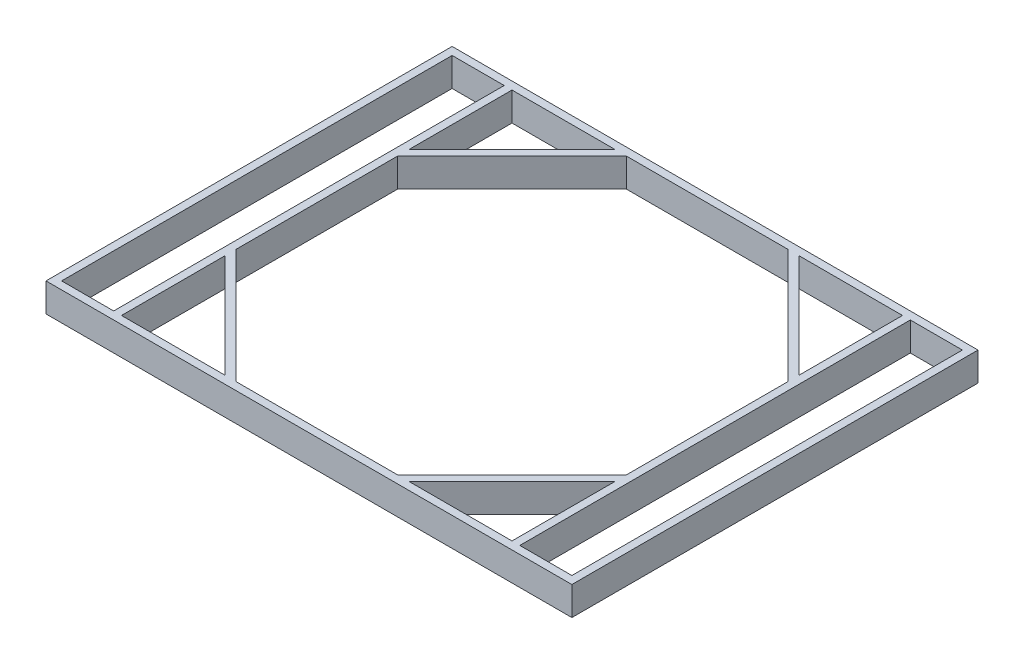
ISO-10303-21;
HEADER;
FILE_DESCRIPTION(('STEP AP214'),'2;1');
FILE_NAME('part.step','',(''),(''),'','','');
FILE_SCHEMA(('AUTOMOTIVE_DESIGN { 1 0 10303 214 1 1 1 1 }'));
ENDSEC;
DATA;
#1=APPLICATION_CONTEXT('core data for automotive mechanical design processes');
#2=APPLICATION_PROTOCOL_DEFINITION('international standard','automotive_design',2000,#1);
#3=PRODUCT_CONTEXT('',#1,'mechanical');
#4=PRODUCT('Part','Part','',(#3));
#5=PRODUCT_RELATED_PRODUCT_CATEGORY('part','',(#4));
#6=PRODUCT_DEFINITION_FORMATION('','',#4);
#7=PRODUCT_DEFINITION_CONTEXT('part definition',#1,'design');
#8=PRODUCT_DEFINITION('design','',#6,#7);
#9=PRODUCT_DEFINITION_SHAPE('','',#8);
#10=(LENGTH_UNIT() NAMED_UNIT(*) SI_UNIT(.MILLI.,.METRE.));
#11=(NAMED_UNIT(*) PLANE_ANGLE_UNIT() SI_UNIT($,.RADIAN.));
#12=(NAMED_UNIT(*) SI_UNIT($,.STERADIAN.) SOLID_ANGLE_UNIT());
#13=UNCERTAINTY_MEASURE_WITH_UNIT(LENGTH_MEASURE(1.E-05),#10,'distance_accuracy_value','');
#14=(GEOMETRIC_REPRESENTATION_CONTEXT(3) GLOBAL_UNCERTAINTY_ASSIGNED_CONTEXT((#13)) GLOBAL_UNIT_ASSIGNED_CONTEXT((#10,
#11,#12)) REPRESENTATION_CONTEXT('',''));
#15=CARTESIAN_POINT('',(0.,0.,0.));
#16=DIRECTION('',(0.,0.,1.));
#17=DIRECTION('',(1.,0.,0.));
#18=AXIS2_PLACEMENT_3D('',#15,#16,#17);
#19=CARTESIAN_POINT('',(0.,0.,0.));
#20=DIRECTION('',(0.,1.,0.));
#21=DIRECTION('',(0.,0.,1.));
#22=AXIS2_PLACEMENT_3D('',#19,#20,#21);
#23=PLANE('',#22);
#24=DIRECTION('',(0.,0.,1.));
#25=VECTOR('',#24,1.);
#26=CARTESIAN_POINT('',(30.6758446379566,0.,0.));
#27=LINE('',#26,#25);
#28=CARTESIAN_POINT('',(30.6758446379566,0.,15.6020555655613));
#29=VERTEX_POINT('',#28);
#30=CARTESIAN_POINT('',(30.6758446379568,0.,1920.60205556556));
#31=VERTEX_POINT('',#30);
#32=EDGE_CURVE('E716',#29,#31,#27,.T.);
#33=ORIENTED_EDGE('',*,*,#32,.F.);
#34=DIRECTION('',(1.,0.,0.));
#35=VECTOR('',#34,1.);
#36=CARTESIAN_POINT('',(0.,0.,15.6020555655613));
#37=LINE('',#36,#35);
#38=CARTESIAN_POINT('',(-223.324155362043,0.,15.6020555655613));
#39=VERTEX_POINT('',#38);
#40=EDGE_CURVE('E478',#39,#29,#37,.T.);
#41=ORIENTED_EDGE('',*,*,#40,.F.);
#42=DIRECTION('',(0.,0.,1.));
#43=VECTOR('',#42,1.);
#44=CARTESIAN_POINT('',(-223.324155362043,0.,0.));
#45=LINE('',#44,#43);
#46=CARTESIAN_POINT('',(-223.324155362043,0.,1920.60205556556));
#47=VERTEX_POINT('',#46);
#48=EDGE_CURVE('E695',#39,#47,#45,.T.);
#49=ORIENTED_EDGE('',*,*,#48,.T.);
#50=DIRECTION('',(1.,0.,0.));
#51=VECTOR('',#50,1.);
#52=CARTESIAN_POINT('',(0.,0.,1920.60205556556));
#53=LINE('',#52,#51);
#54=EDGE_CURVE('E512',#47,#31,#53,.T.);
#55=ORIENTED_EDGE('',*,*,#54,.T.);
#56=EDGE_LOOP('',(#33,#41,#49,#55));
#57=FACE_BOUND('',#56,.T.);
#58=DIRECTION('',(0.707106781186546,0.,-0.707106781186549));
#59=VECTOR('',#58,1.);
#60=CARTESIAN_POINT('',(294.228972658366,0.,294.228972658365));
#61=LINE('',#60,#59);
#62=CARTESIAN_POINT('',(68.7758446379566,0.,519.682100678775));
#63=VERTEX_POINT('',#62);
#64=CARTESIAN_POINT('',(572.855889751168,0.,15.6020555655612));
#65=VERTEX_POINT('',#64);
#66=EDGE_CURVE('E470',#63,#65,#61,.T.);
#67=ORIENTED_EDGE('',*,*,#66,.T.);
#68=CARTESIAN_POINT('',(68.7758446379566,0.,15.6020555655613));
#69=VERTEX_POINT('',#68);
#70=EDGE_CURVE('E466',#69,#65,#37,.T.);
#71=ORIENTED_EDGE('',*,*,#70,.F.);
#72=DIRECTION('',(0.,0.,1.));
#73=VECTOR('',#72,1.);
#74=CARTESIAN_POINT('',(68.7758446379566,0.,0.));
#75=LINE('',#74,#73);
#76=EDGE_CURVE('E471',#69,#63,#75,.T.);
#77=ORIENTED_EDGE('',*,*,#76,.T.);
#78=EDGE_LOOP('',(#67,#71,#77));
#79=FACE_BOUND('',#78,.T.);
#80=DIRECTION('',(0.707106781186546,0.,0.707106781186549));
#81=VECTOR('',#80,1.);
#82=CARTESIAN_POINT('',(700.106103616387,0.,-700.106103616385));
#83=LINE('',#82,#81);
#84=CARTESIAN_POINT('',(1415.81426279833,0.,15.6020555655613));
#85=VERTEX_POINT('',#84);
#86=CARTESIAN_POINT('',(1973.77584463796,0.,573.563637405189));
#87=VERTEX_POINT('',#86);
#88=EDGE_CURVE('E474',#85,#87,#83,.T.);
#89=ORIENTED_EDGE('',*,*,#88,.F.);
#90=CARTESIAN_POINT('',(626.737426477582,0.,15.6020555655613));
#91=VERTEX_POINT('',#90);
#92=EDGE_CURVE('E473',#91,#85,#37,.T.);
#93=ORIENTED_EDGE('',*,*,#92,.F.);
#94=DIRECTION('',(-0.707106781186546,0.,0.707106781186549));
#95=VECTOR('',#94,1.);
#96=CARTESIAN_POINT('',(321.169741021573,0.,321.169741021572));
#97=LINE('',#96,#95);
#98=CARTESIAN_POINT('',(68.7758446379566,0.,573.563637405189));
#99=VERTEX_POINT('',#98);
#100=EDGE_CURVE('E733',#91,#99,#97,.T.);
#101=ORIENTED_EDGE('',*,*,#100,.T.);
#102=CARTESIAN_POINT('',(68.7758446379567,0.,1362.64047372595));
#103=VERTEX_POINT('',#102);
#104=EDGE_CURVE('E692',#99,#103,#75,.T.);
#105=ORIENTED_EDGE('',*,*,#104,.T.);
#106=DIRECTION('',(-0.707106781186557,0.,-0.707106781186539));
#107=VECTOR('',#106,1.);
#108=CARTESIAN_POINT('',(-646.932314544,0.,646.932314544016));
#109=LINE('',#108,#107);
#110=CARTESIAN_POINT('',(626.737426477578,0.,1920.60205556556));
#111=VERTEX_POINT('',#110);
#112=EDGE_CURVE('E685',#111,#103,#109,.T.);
#113=ORIENTED_EDGE('',*,*,#112,.F.);
#114=CARTESIAN_POINT('',(1415.81426279833,0.,1920.60205556556));
#115=VERTEX_POINT('',#114);
#116=EDGE_CURVE('E683',#111,#115,#53,.T.);
#117=ORIENTED_EDGE('',*,*,#116,.T.);
#118=DIRECTION('',(-0.707106781186544,0.,0.707106781186551));
#119=VECTOR('',#118,1.);
#120=CARTESIAN_POINT('',(1668.20815918195,0.,1668.20815918194));
#121=LINE('',#120,#119);
#122=CARTESIAN_POINT('',(1973.77584463796,0.,1362.64047372593));
#123=VERTEX_POINT('',#122);
#124=EDGE_CURVE('E686',#123,#115,#121,.T.);
#125=ORIENTED_EDGE('',*,*,#124,.F.);
#126=DIRECTION('',(0.,0.,1.));
#127=VECTOR('',#126,1.);
#128=CARTESIAN_POINT('',(1973.77584463796,0.,-2.30061038127667E-13));
#129=LINE('',#128,#127);
#130=EDGE_CURVE('E457',#87,#123,#129,.T.);
#131=ORIENTED_EDGE('',*,*,#130,.F.);
#132=EDGE_LOOP('',(#89,#93,#101,#105,#113,#117,#125,#131));
#133=FACE_BOUND('',#132,.T.);
#134=CARTESIAN_POINT('',(1973.77584463796,0.,15.6020555655613));
#135=VERTEX_POINT('',#134);
#136=CARTESIAN_POINT('',(1973.77584463796,0.,519.682100678774));
#137=VERTEX_POINT('',#136);
#138=EDGE_CURVE('E456',#135,#137,#129,.T.);
#139=ORIENTED_EDGE('',*,*,#138,.F.);
#140=CARTESIAN_POINT('',(1469.69579952475,0.,15.6020555655613));
#141=VERTEX_POINT('',#140);
#142=EDGE_CURVE('E472',#141,#135,#37,.T.);
#143=ORIENTED_EDGE('',*,*,#142,.F.);
#144=DIRECTION('',(0.707106781186546,0.,0.707106781186549));
#145=VECTOR('',#144,1.);
#146=CARTESIAN_POINT('',(727.046871979594,0.,-727.046871979592));
#147=LINE('',#146,#145);
#148=EDGE_CURVE('E721',#141,#137,#147,.T.);
#149=ORIENTED_EDGE('',*,*,#148,.T.);
#150=EDGE_LOOP('',(#139,#143,#149));
#151=FACE_BOUND('',#150,.T.);
#152=DIRECTION('',(1.,0.,0.));
#153=VECTOR('',#152,1.);
#154=CARTESIAN_POINT('',(0.,0.,-22.4979444344387));
#155=LINE('',#154,#153);
#156=CARTESIAN_POINT('',(-261.424155362043,0.,-22.4979444344387));
#157=VERTEX_POINT('',#156);
#158=CARTESIAN_POINT('',(2303.97584463796,0.,-22.4979444344387));
#159=VERTEX_POINT('',#158);
#160=EDGE_CURVE('E697',#157,#159,#155,.T.);
#161=ORIENTED_EDGE('',*,*,#160,.T.);
#162=DIRECTION('',(0.,0.,1.));
#163=VECTOR('',#162,1.);
#164=CARTESIAN_POINT('',(2303.97584463796,0.,-5.1643994163078E-13));
#165=LINE('',#164,#163);
#166=CARTESIAN_POINT('',(2303.97584463796,0.,1958.70205556556));
#167=VERTEX_POINT('',#166);
#168=EDGE_CURVE('E737',#159,#167,#165,.T.);
#169=ORIENTED_EDGE('',*,*,#168,.T.);
#170=DIRECTION('',(1.,0.,0.));
#171=VECTOR('',#170,1.);
#172=CARTESIAN_POINT('',(0.,0.,1958.70205556556));
#173=LINE('',#172,#171);
#174=CARTESIAN_POINT('',(-261.424155362043,0.,1958.70205556556));
#175=VERTEX_POINT('',#174);
#176=EDGE_CURVE('E732',#175,#167,#173,.T.);
#177=ORIENTED_EDGE('',*,*,#176,.F.);
#178=DIRECTION('',(0.,0.,1.));
#179=VECTOR('',#178,1.);
#180=CARTESIAN_POINT('',(-261.424155362043,0.,0.));
#181=LINE('',#180,#179);
#182=EDGE_CURVE('E696',#157,#175,#181,.T.);
#183=ORIENTED_EDGE('',*,*,#182,.F.);
#184=EDGE_LOOP('',(#161,#169,#177,#183));
#185=FACE_BOUND('',#184,.T.);
#186=CARTESIAN_POINT('',(2011.87584463796,0.,15.6020555655613));
#187=VERTEX_POINT('',#186);
#188=CARTESIAN_POINT('',(2265.87584463796,0.,15.6020555655613));
#189=VERTEX_POINT('',#188);
#190=EDGE_CURVE('E465',#187,#189,#37,.T.);
#191=ORIENTED_EDGE('',*,*,#190,.F.);
#192=DIRECTION('',(0.,0.,1.));
#193=VECTOR('',#192,1.);
#194=CARTESIAN_POINT('',(2011.87584463796,0.,-4.69003860452335E-13));
#195=LINE('',#194,#193);
#196=CARTESIAN_POINT('',(2011.87584463796,0.,1920.60205556556));
#197=VERTEX_POINT('',#196);
#198=EDGE_CURVE('E462',#187,#197,#195,.T.);
#199=ORIENTED_EDGE('',*,*,#198,.T.);
#200=CARTESIAN_POINT('',(2265.87584463796,0.,1920.60205556556));
#201=VERTEX_POINT('',#200);
#202=EDGE_CURVE('E460',#197,#201,#53,.T.);
#203=ORIENTED_EDGE('',*,*,#202,.T.);
#204=DIRECTION('',(0.,0.,1.));
#205=VECTOR('',#204,1.);
#206=CARTESIAN_POINT('',(2265.87584463796,0.,0.));
#207=LINE('',#206,#205);
#208=EDGE_CURVE('E485',#189,#201,#207,.T.);
#209=ORIENTED_EDGE('',*,*,#208,.F.);
#210=EDGE_LOOP('',(#191,#199,#203,#209));
#211=FACE_BOUND('',#210,.T.);
#212=DIRECTION('',(0.707106781186544,0.,-0.707106781186551));
#213=VECTOR('',#212,1.);
#214=CARTESIAN_POINT('',(1695.14892754516,0.,1695.14892754514));
#215=LINE('',#214,#213);
#216=CARTESIAN_POINT('',(1469.69579952475,0.,1920.60205556556));
#217=VERTEX_POINT('',#216);
#218=CARTESIAN_POINT('',(1973.77584463796,0.,1416.52201045235));
#219=VERTEX_POINT('',#218);
#220=EDGE_CURVE('E449',#217,#219,#215,.T.);
#221=ORIENTED_EDGE('',*,*,#220,.F.);
#222=CARTESIAN_POINT('',(1973.77584463796,0.,1920.60205556556));
#223=VERTEX_POINT('',#222);
#224=EDGE_CURVE('E455',#217,#223,#53,.T.);
#225=ORIENTED_EDGE('',*,*,#224,.T.);
#226=EDGE_CURVE('E452',#219,#223,#129,.T.);
#227=ORIENTED_EDGE('',*,*,#226,.F.);
#228=EDGE_LOOP('',(#221,#225,#227));
#229=FACE_BOUND('',#228,.T.);
#230=DIRECTION('',(0.707106781186556,0.,0.707106781186539));
#231=VECTOR('',#230,1.);
#232=CARTESIAN_POINT('',(-673.873082907207,0.,673.873082907224));
#233=LINE('',#232,#231);
#234=CARTESIAN_POINT('',(68.7758446379567,0.,1416.52201045237));
#235=VERTEX_POINT('',#234);
#236=CARTESIAN_POINT('',(572.855889751162,0.,1920.60205556556));
#237=VERTEX_POINT('',#236);
#238=EDGE_CURVE('E380',#235,#237,#233,.T.);
#239=ORIENTED_EDGE('',*,*,#238,.F.);
#240=CARTESIAN_POINT('',(68.7758446379567,0.,1920.60205556556));
#241=VERTEX_POINT('',#240);
#242=EDGE_CURVE('E407',#235,#241,#75,.T.);
#243=ORIENTED_EDGE('',*,*,#242,.T.);
#244=EDGE_CURVE('E461',#241,#237,#53,.T.);
#245=ORIENTED_EDGE('',*,*,#244,.T.);
#246=EDGE_LOOP('',(#239,#243,#245));
#247=FACE_BOUND('',#246,.T.);
#248=ADVANCED_FACE('F154',(#57,#79,#133,#151,#185,#211,#229,#247),#23,.F.);
#249=CARTESIAN_POINT('',(0.,139.7,15.6020555655613));
#250=DIRECTION('',(0.,0.,-1.));
#251=DIRECTION('',(-1.,0.,0.));
#252=AXIS2_PLACEMENT_3D('',#249,#250,#251);
#253=PLANE('',#252);
#254=ORIENTED_EDGE('',*,*,#40,.T.);
#255=DIRECTION('',(0.,-1.,0.));
#256=VECTOR('',#255,1.);
#257=CARTESIAN_POINT('',(30.6758446379566,139.7,15.6020555655613));
#258=LINE('',#257,#256);
#259=CARTESIAN_POINT('',(30.6758446379566,139.7,15.6020555655613));
#260=VERTEX_POINT('',#259);
#261=EDGE_CURVE('E518',#260,#29,#258,.T.);
#262=ORIENTED_EDGE('',*,*,#261,.F.);
#263=DIRECTION('',(1.,0.,0.));
#264=VECTOR('',#263,1.);
#265=CARTESIAN_POINT('',(0.,139.7,15.6020555655613));
#266=LINE('',#265,#264);
#267=CARTESIAN_POINT('',(-223.324155362043,139.7,15.6020555655613));
#268=VERTEX_POINT('',#267);
#269=EDGE_CURVE('E443',#268,#260,#266,.T.);
#270=ORIENTED_EDGE('',*,*,#269,.F.);
#271=DIRECTION('',(0.,-1.,0.));
#272=VECTOR('',#271,1.);
#273=CARTESIAN_POINT('',(-223.324155362043,139.7,15.6020555655613));
#274=LINE('',#273,#272);
#275=EDGE_CURVE('E500',#268,#39,#274,.T.);
#276=ORIENTED_EDGE('',*,*,#275,.T.);
#277=EDGE_LOOP('',(#254,#262,#270,#276));
#278=FACE_BOUND('',#277,.T.);
#279=ADVANCED_FACE('F585',(#278),#253,.F.);
#280=ORIENTED_EDGE('',*,*,#70,.T.);
#281=DIRECTION('',(0.,-1.,0.));
#282=VECTOR('',#281,1.);
#283=CARTESIAN_POINT('',(572.855889751168,139.7,15.6020555655612));
#284=LINE('',#283,#282);
#285=CARTESIAN_POINT('',(572.855889751168,139.7,15.6020555655612));
#286=VERTEX_POINT('',#285);
#287=EDGE_CURVE('E711',#286,#65,#284,.T.);
#288=ORIENTED_EDGE('',*,*,#287,.F.);
#289=CARTESIAN_POINT('',(68.7758446379566,139.7,15.6020555655613));
#290=VERTEX_POINT('',#289);
#291=EDGE_CURVE('E424',#290,#286,#266,.T.);
#292=ORIENTED_EDGE('',*,*,#291,.F.);
#293=DIRECTION('',(0.,-1.,0.));
#294=VECTOR('',#293,1.);
#295=CARTESIAN_POINT('',(68.7758446379566,139.7,15.6020555655613));
#296=LINE('',#295,#294);
#297=EDGE_CURVE('E707',#290,#69,#296,.T.);
#298=ORIENTED_EDGE('',*,*,#297,.T.);
#299=EDGE_LOOP('',(#280,#288,#292,#298));
#300=FACE_BOUND('',#299,.T.);
#301=ADVANCED_FACE('F595',(#300),#253,.F.);
#302=ORIENTED_EDGE('',*,*,#92,.T.);
#303=DIRECTION('',(0.,-1.,0.));
#304=VECTOR('',#303,1.);
#305=CARTESIAN_POINT('',(1415.81426279833,139.7,15.6020555655613));
#306=LINE('',#305,#304);
#307=CARTESIAN_POINT('',(1415.81426279833,139.7,15.6020555655613));
#308=VERTEX_POINT('',#307);
#309=EDGE_CURVE('E535',#308,#85,#306,.T.);
#310=ORIENTED_EDGE('',*,*,#309,.F.);
#311=CARTESIAN_POINT('',(626.737426477582,139.7,15.6020555655613));
#312=VERTEX_POINT('',#311);
#313=EDGE_CURVE('E433',#312,#308,#266,.T.);
#314=ORIENTED_EDGE('',*,*,#313,.F.);
#315=DIRECTION('',(0.,-1.,0.));
#316=VECTOR('',#315,1.);
#317=CARTESIAN_POINT('',(626.737426477582,139.7,15.6020555655613));
#318=LINE('',#317,#316);
#319=EDGE_CURVE('E537',#312,#91,#318,.T.);
#320=ORIENTED_EDGE('',*,*,#319,.T.);
#321=EDGE_LOOP('',(#302,#310,#314,#320));
#322=FACE_BOUND('',#321,.T.);
#323=ADVANCED_FACE('F599',(#322),#253,.F.);
#324=ORIENTED_EDGE('',*,*,#142,.T.);
#325=DIRECTION('',(0.,-1.,0.));
#326=VECTOR('',#325,1.);
#327=CARTESIAN_POINT('',(1973.77584463796,139.7,15.6020555655613));
#328=LINE('',#327,#326);
#329=CARTESIAN_POINT('',(1973.77584463796,139.7,15.6020555655613));
#330=VERTEX_POINT('',#329);
#331=EDGE_CURVE('E514',#330,#135,#328,.T.);
#332=ORIENTED_EDGE('',*,*,#331,.F.);
#333=CARTESIAN_POINT('',(1469.69579952475,139.7,15.6020555655613));
#334=VERTEX_POINT('',#333);
#335=EDGE_CURVE('E446',#334,#330,#266,.T.);
#336=ORIENTED_EDGE('',*,*,#335,.F.);
#337=DIRECTION('',(0.,-1.,0.));
#338=VECTOR('',#337,1.);
#339=CARTESIAN_POINT('',(1469.69579952475,139.7,15.6020555655613));
#340=LINE('',#339,#338);
#341=EDGE_CURVE('E516',#334,#141,#340,.T.);
#342=ORIENTED_EDGE('',*,*,#341,.T.);
#343=EDGE_LOOP('',(#324,#332,#336,#342));
#344=FACE_BOUND('',#343,.T.);
#345=ADVANCED_FACE('F598',(#344),#253,.F.);
#346=ORIENTED_EDGE('',*,*,#190,.T.);
#347=DIRECTION('',(0.,-1.,0.));
#348=VECTOR('',#347,1.);
#349=CARTESIAN_POINT('',(2265.87584463796,139.7,15.6020555655613));
#350=LINE('',#349,#348);
#351=CARTESIAN_POINT('',(2265.87584463796,139.7,15.6020555655613));
#352=VERTEX_POINT('',#351);
#353=EDGE_CURVE('E555',#352,#189,#350,.T.);
#354=ORIENTED_EDGE('',*,*,#353,.F.);
#355=CARTESIAN_POINT('',(2011.87584463796,139.7,15.6020555655613));
#356=VERTEX_POINT('',#355);
#357=EDGE_CURVE('E158',#356,#352,#266,.T.);
#358=ORIENTED_EDGE('',*,*,#357,.F.);
#359=DIRECTION('',(0.,-1.,0.));
#360=VECTOR('',#359,1.);
#361=CARTESIAN_POINT('',(2011.87584463796,139.7,15.6020555655613));
#362=LINE('',#361,#360);
#363=EDGE_CURVE('E557',#356,#187,#362,.T.);
#364=ORIENTED_EDGE('',*,*,#363,.T.);
#365=EDGE_LOOP('',(#346,#354,#358,#364));
#366=FACE_BOUND('',#365,.T.);
#367=ADVANCED_FACE('F618',(#366),#253,.F.);
#368=CARTESIAN_POINT('',(-223.324155362043,139.7,0.));
#369=DIRECTION('',(1.,0.,0.));
#370=DIRECTION('',(0.,0.,-1.));
#371=AXIS2_PLACEMENT_3D('',#368,#369,#370);
#372=PLANE('',#371);
#373=ORIENTED_EDGE('',*,*,#48,.F.);
#374=ORIENTED_EDGE('',*,*,#275,.F.);
#375=DIRECTION('',(0.,0.,1.));
#376=VECTOR('',#375,1.);
#377=CARTESIAN_POINT('',(-223.324155362043,139.7,0.));
#378=LINE('',#377,#376);
#379=CARTESIAN_POINT('',(-223.324155362043,139.7,1920.60205556556));
#380=VERTEX_POINT('',#379);
#381=EDGE_CURVE('E394',#268,#380,#378,.T.);
#382=ORIENTED_EDGE('',*,*,#381,.T.);
#383=DIRECTION('',(0.,-1.,0.));
#384=VECTOR('',#383,1.);
#385=CARTESIAN_POINT('',(-223.324155362043,139.7,1920.60205556556));
#386=LINE('',#385,#384);
#387=EDGE_CURVE('E498',#380,#47,#386,.T.);
#388=ORIENTED_EDGE('',*,*,#387,.T.);
#389=EDGE_LOOP('',(#373,#374,#382,#388));
#390=FACE_BOUND('',#389,.T.);
#391=ADVANCED_FACE('F497',(#390),#372,.T.);
#392=CARTESIAN_POINT('',(-261.424155362043,139.7,0.));
#393=DIRECTION('',(1.,0.,0.));
#394=DIRECTION('',(0.,0.,-1.));
#395=AXIS2_PLACEMENT_3D('',#392,#393,#394);
#396=PLANE('',#395);
#397=ORIENTED_EDGE('',*,*,#182,.T.);
#398=DIRECTION('',(0.,-1.,0.));
#399=VECTOR('',#398,1.);
#400=CARTESIAN_POINT('',(-261.424155362043,139.7,1958.70205556556));
#401=LINE('',#400,#399);
#402=CARTESIAN_POINT('',(-261.424155362043,139.7,1958.70205556556));
#403=VERTEX_POINT('',#402);
#404=EDGE_CURVE('E523',#403,#175,#401,.T.);
#405=ORIENTED_EDGE('',*,*,#404,.F.);
#406=DIRECTION('',(0.,0.,1.));
#407=VECTOR('',#406,1.);
#408=CARTESIAN_POINT('',(-261.424155362043,139.7,0.));
#409=LINE('',#408,#407);
#410=CARTESIAN_POINT('',(-261.424155362043,139.7,-22.4979444344387));
#411=VERTEX_POINT('',#410);
#412=EDGE_CURVE('E395',#411,#403,#409,.T.);
#413=ORIENTED_EDGE('',*,*,#412,.F.);
#414=DIRECTION('',(0.,-1.,0.));
#415=VECTOR('',#414,1.);
#416=CARTESIAN_POINT('',(-261.424155362043,139.7,-22.4979444344387));
#417=LINE('',#416,#415);
#418=EDGE_CURVE('E526',#411,#157,#417,.T.);
#419=ORIENTED_EDGE('',*,*,#418,.T.);
#420=EDGE_LOOP('',(#397,#405,#413,#419));
#421=FACE_BOUND('',#420,.T.);
#422=ADVANCED_FACE('F635',(#421),#396,.F.);
#423=CARTESIAN_POINT('',(0.,139.7,-22.4979444344387));
#424=DIRECTION('',(0.,0.,-1.));
#425=DIRECTION('',(-1.,0.,0.));
#426=AXIS2_PLACEMENT_3D('',#423,#424,#425);
#427=PLANE('',#426);
#428=DIRECTION('',(0.,-1.,0.));
#429=VECTOR('',#428,1.);
#430=CARTESIAN_POINT('',(2303.97584463796,139.7,-22.4979444344387));
#431=LINE('',#430,#429);
#432=CARTESIAN_POINT('',(2303.97584463796,139.7,-22.4979444344387));
#433=VERTEX_POINT('',#432);
#434=EDGE_CURVE('E529',#433,#159,#431,.T.);
#435=ORIENTED_EDGE('',*,*,#434,.T.);
#436=ORIENTED_EDGE('',*,*,#160,.F.);
#437=ORIENTED_EDGE('',*,*,#418,.F.);
#438=DIRECTION('',(1.,0.,0.));
#439=VECTOR('',#438,1.);
#440=CARTESIAN_POINT('',(0.,139.7,-22.4979444344387));
#441=LINE('',#440,#439);
#442=EDGE_CURVE('E439',#411,#433,#441,.T.);
#443=ORIENTED_EDGE('',*,*,#442,.T.);
#444=EDGE_LOOP('',(#435,#436,#437,#443));
#445=FACE_BOUND('',#444,.T.);
#446=ADVANCED_FACE('F638',(#445),#427,.T.);
#447=CARTESIAN_POINT('',(2265.87584463796,139.7,0.));
#448=DIRECTION('',(1.,0.,0.));
#449=DIRECTION('',(0.,0.,-1.));
#450=AXIS2_PLACEMENT_3D('',#447,#448,#449);
#451=PLANE('',#450);
#452=ORIENTED_EDGE('',*,*,#208,.T.);
#453=DIRECTION('',(0.,-1.,0.));
#454=VECTOR('',#453,1.);
#455=CARTESIAN_POINT('',(2265.87584463796,139.7,1920.60205556556));
#456=LINE('',#455,#454);
#457=CARTESIAN_POINT('',(2265.87584463796,139.7,1920.60205556556));
#458=VERTEX_POINT('',#457);
#459=EDGE_CURVE('E553',#458,#201,#456,.T.);
#460=ORIENTED_EDGE('',*,*,#459,.F.);
#461=DIRECTION('',(0.,0.,1.));
#462=VECTOR('',#461,1.);
#463=CARTESIAN_POINT('',(2265.87584463796,139.7,0.));
#464=LINE('',#463,#462);
#465=EDGE_CURVE('E417',#352,#458,#464,.T.);
#466=ORIENTED_EDGE('',*,*,#465,.F.);
#467=ORIENTED_EDGE('',*,*,#353,.T.);
#468=EDGE_LOOP('',(#452,#460,#466,#467));
#469=FACE_BOUND('',#468,.T.);
#470=ADVANCED_FACE('F641',(#469),#451,.F.);
#471=CARTESIAN_POINT('',(0.,139.7,1958.70205556556));
#472=DIRECTION('',(0.,0.,-1.));
#473=DIRECTION('',(-1.,0.,0.));
#474=AXIS2_PLACEMENT_3D('',#471,#472,#473);
#475=PLANE('',#474);
#476=DIRECTION('',(0.,-1.,0.));
#477=VECTOR('',#476,1.);
#478=CARTESIAN_POINT('',(2303.97584463796,139.7,1958.70205556556));
#479=LINE('',#478,#477);
#480=CARTESIAN_POINT('',(2303.97584463796,139.7,1958.70205556556));
#481=VERTEX_POINT('',#480);
#482=EDGE_CURVE('E532',#481,#167,#479,.T.);
#483=ORIENTED_EDGE('',*,*,#482,.F.);
#484=DIRECTION('',(1.,0.,0.));
#485=VECTOR('',#484,1.);
#486=CARTESIAN_POINT('',(0.,139.7,1958.70205556556));
#487=LINE('',#486,#485);
#488=EDGE_CURVE('E434',#403,#481,#487,.T.);
#489=ORIENTED_EDGE('',*,*,#488,.F.);
#490=ORIENTED_EDGE('',*,*,#404,.T.);
#491=ORIENTED_EDGE('',*,*,#176,.T.);
#492=EDGE_LOOP('',(#483,#489,#490,#491));
#493=FACE_BOUND('',#492,.T.);
#494=ADVANCED_FACE('F586',(#493),#475,.F.);
#495=CARTESIAN_POINT('',(2303.97584463796,139.7,-5.1643994163078E-13));
#496=DIRECTION('',(1.,0.,0.));
#497=DIRECTION('',(0.,0.,-1.));
#498=AXIS2_PLACEMENT_3D('',#495,#496,#497);
#499=PLANE('',#498);
#500=ORIENTED_EDGE('',*,*,#168,.F.);
#501=ORIENTED_EDGE('',*,*,#434,.F.);
#502=DIRECTION('',(0.,0.,1.));
#503=VECTOR('',#502,1.);
#504=CARTESIAN_POINT('',(2303.97584463796,139.7,-5.1643994163078E-13));
#505=LINE('',#504,#503);
#506=EDGE_CURVE('E436',#433,#481,#505,.T.);
#507=ORIENTED_EDGE('',*,*,#506,.T.);
#508=ORIENTED_EDGE('',*,*,#482,.T.);
#509=EDGE_LOOP('',(#500,#501,#507,#508));
#510=FACE_BOUND('',#509,.T.);
#511=ADVANCED_FACE('F575',(#510),#499,.T.);
#512=CARTESIAN_POINT('',(0.,139.7,0.));
#513=DIRECTION('',(0.,1.,0.));
#514=DIRECTION('',(0.,0.,1.));
#515=AXIS2_PLACEMENT_3D('',#512,#513,#514);
#516=PLANE('',#515);
#517=ORIENTED_EDGE('',*,*,#269,.T.);
#518=DIRECTION('',(0.,0.,1.));
#519=VECTOR('',#518,1.);
#520=CARTESIAN_POINT('',(30.6758446379566,139.7,0.));
#521=LINE('',#520,#519);
#522=CARTESIAN_POINT('',(30.6758446379568,139.7,1920.60205556556));
#523=VERTEX_POINT('',#522);
#524=EDGE_CURVE('E410',#260,#523,#521,.T.);
#525=ORIENTED_EDGE('',*,*,#524,.T.);
#526=DIRECTION('',(1.,0.,0.));
#527=VECTOR('',#526,1.);
#528=CARTESIAN_POINT('',(0.,139.7,1920.60205556556));
#529=LINE('',#528,#527);
#530=EDGE_CURVE('E385',#380,#523,#529,.T.);
#531=ORIENTED_EDGE('',*,*,#530,.F.);
#532=ORIENTED_EDGE('',*,*,#381,.F.);
#533=EDGE_LOOP('',(#517,#525,#531,#532));
#534=FACE_BOUND('',#533,.T.);
#535=ORIENTED_EDGE('',*,*,#291,.T.);
#536=DIRECTION('',(0.707106781186546,0.,-0.707106781186549));
#537=VECTOR('',#536,1.);
#538=CARTESIAN_POINT('',(294.228972658366,139.7,294.228972658365));
#539=LINE('',#538,#537);
#540=CARTESIAN_POINT('',(68.7758446379566,139.7,519.682100678775));
#541=VERTEX_POINT('',#540);
#542=EDGE_CURVE('E377',#541,#286,#539,.T.);
#543=ORIENTED_EDGE('',*,*,#542,.F.);
#544=DIRECTION('',(0.,0.,1.));
#545=VECTOR('',#544,1.);
#546=CARTESIAN_POINT('',(68.7758446379566,139.7,0.));
#547=LINE('',#546,#545);
#548=EDGE_CURVE('E389',#290,#541,#547,.T.);
#549=ORIENTED_EDGE('',*,*,#548,.F.);
#550=EDGE_LOOP('',(#535,#543,#549));
#551=FACE_BOUND('',#550,.T.);
#552=ORIENTED_EDGE('',*,*,#313,.T.);
#553=DIRECTION('',(0.707106781186546,0.,0.707106781186549));
#554=VECTOR('',#553,1.);
#555=CARTESIAN_POINT('',(700.106103616387,139.7,-700.106103616385));
#556=LINE('',#555,#554);
#557=CARTESIAN_POINT('',(1973.77584463796,139.7,573.563637405189));
#558=VERTEX_POINT('',#557);
#559=EDGE_CURVE('E412',#308,#558,#556,.T.);
#560=ORIENTED_EDGE('',*,*,#559,.T.);
#561=DIRECTION('',(0.,0.,1.));
#562=VECTOR('',#561,1.);
#563=CARTESIAN_POINT('',(1973.77584463796,139.7,-2.30061038127667E-13));
#564=LINE('',#563,#562);
#565=CARTESIAN_POINT('',(1973.77584463796,139.7,1362.64047372593));
#566=VERTEX_POINT('',#565);
#567=EDGE_CURVE('E405',#558,#566,#564,.T.);
#568=ORIENTED_EDGE('',*,*,#567,.T.);
#569=DIRECTION('',(-0.707106781186544,0.,0.707106781186551));
#570=VECTOR('',#569,1.);
#571=CARTESIAN_POINT('',(1668.20815918195,139.7,1668.20815918194));
#572=LINE('',#571,#570);
#573=CARTESIAN_POINT('',(1415.81426279833,139.7,1920.60205556556));
#574=VERTEX_POINT('',#573);
#575=EDGE_CURVE('E411',#566,#574,#572,.T.);
#576=ORIENTED_EDGE('',*,*,#575,.T.);
#577=CARTESIAN_POINT('',(626.737426477578,139.7,1920.60205556556));
#578=VERTEX_POINT('',#577);
#579=EDGE_CURVE('E396',#578,#574,#529,.T.);
#580=ORIENTED_EDGE('',*,*,#579,.F.);
#581=DIRECTION('',(-0.707106781186557,0.,-0.707106781186539));
#582=VECTOR('',#581,1.);
#583=CARTESIAN_POINT('',(-646.932314544,139.7,646.932314544016));
#584=LINE('',#583,#582);
#585=CARTESIAN_POINT('',(68.7758446379567,139.7,1362.64047372595));
#586=VERTEX_POINT('',#585);
#587=EDGE_CURVE('E427',#578,#586,#584,.T.);
#588=ORIENTED_EDGE('',*,*,#587,.T.);
#589=CARTESIAN_POINT('',(68.7758446379566,139.7,573.563637405189));
#590=VERTEX_POINT('',#589);
#591=EDGE_CURVE('E390',#590,#586,#547,.T.);
#592=ORIENTED_EDGE('',*,*,#591,.F.);
#593=DIRECTION('',(-0.707106781186546,0.,0.707106781186549));
#594=VECTOR('',#593,1.);
#595=CARTESIAN_POINT('',(321.169741021573,139.7,321.169741021572));
#596=LINE('',#595,#594);
#597=EDGE_CURVE('E430',#312,#590,#596,.T.);
#598=ORIENTED_EDGE('',*,*,#597,.F.);
#599=EDGE_LOOP('',(#552,#560,#568,#576,#580,#588,#592,#598));
#600=FACE_BOUND('',#599,.T.);
#601=ORIENTED_EDGE('',*,*,#335,.T.);
#602=CARTESIAN_POINT('',(1973.77584463796,139.7,519.682100678774));
#603=VERTEX_POINT('',#602);
#604=EDGE_CURVE('E404',#330,#603,#564,.T.);
#605=ORIENTED_EDGE('',*,*,#604,.T.);
#606=DIRECTION('',(0.707106781186546,0.,0.707106781186549));
#607=VECTOR('',#606,1.);
#608=CARTESIAN_POINT('',(727.046871979594,139.7,-727.046871979592));
#609=LINE('',#608,#607);
#610=EDGE_CURVE('E409',#334,#603,#609,.T.);
#611=ORIENTED_EDGE('',*,*,#610,.F.);
#612=EDGE_LOOP('',(#601,#605,#611));
#613=FACE_BOUND('',#612,.T.);
#614=ORIENTED_EDGE('',*,*,#357,.T.);
#615=ORIENTED_EDGE('',*,*,#465,.T.);
#616=CARTESIAN_POINT('',(2011.87584463796,139.7,1920.60205556556));
#617=VERTEX_POINT('',#616);
#618=EDGE_CURVE('E398',#617,#458,#529,.T.);
#619=ORIENTED_EDGE('',*,*,#618,.F.);
#620=DIRECTION('',(0.,0.,1.));
#621=VECTOR('',#620,1.);
#622=CARTESIAN_POINT('',(2011.87584463796,139.7,-4.69003860452335E-13));
#623=LINE('',#622,#621);
#624=EDGE_CURVE('E402',#356,#617,#623,.T.);
#625=ORIENTED_EDGE('',*,*,#624,.F.);
#626=EDGE_LOOP('',(#614,#615,#619,#625));
#627=FACE_BOUND('',#626,.T.);
#628=ORIENTED_EDGE('',*,*,#506,.F.);
#629=ORIENTED_EDGE('',*,*,#442,.F.);
#630=ORIENTED_EDGE('',*,*,#412,.T.);
#631=ORIENTED_EDGE('',*,*,#488,.T.);
#632=EDGE_LOOP('',(#628,#629,#630,#631));
#633=FACE_BOUND('',#632,.T.);
#634=DIRECTION('',(0.707106781186544,0.,-0.707106781186551));
#635=VECTOR('',#634,1.);
#636=CARTESIAN_POINT('',(1695.14892754516,139.7,1695.14892754514));
#637=LINE('',#636,#635);
#638=CARTESIAN_POINT('',(1469.69579952475,139.7,1920.60205556556));
#639=VERTEX_POINT('',#638);
#640=CARTESIAN_POINT('',(1973.77584463796,139.7,1416.52201045235));
#641=VERTEX_POINT('',#640);
#642=EDGE_CURVE('E403',#639,#641,#637,.T.);
#643=ORIENTED_EDGE('',*,*,#642,.T.);
#644=CARTESIAN_POINT('',(1973.77584463796,139.7,1920.60205556556));
#645=VERTEX_POINT('',#644);
#646=EDGE_CURVE('E283',#641,#645,#564,.T.);
#647=ORIENTED_EDGE('',*,*,#646,.T.);
#648=EDGE_CURVE('E386',#639,#645,#529,.T.);
#649=ORIENTED_EDGE('',*,*,#648,.F.);
#650=EDGE_LOOP('',(#643,#647,#649));
#651=FACE_BOUND('',#650,.T.);
#652=DIRECTION('',(0.707106781186556,0.,0.707106781186539));
#653=VECTOR('',#652,1.);
#654=CARTESIAN_POINT('',(-673.873082907207,139.7,673.873082907224));
#655=LINE('',#654,#653);
#656=CARTESIAN_POINT('',(68.7758446379567,139.7,1416.52201045237));
#657=VERTEX_POINT('',#656);
#658=CARTESIAN_POINT('',(572.855889751162,139.7,1920.60205556556));
#659=VERTEX_POINT('',#658);
#660=EDGE_CURVE('E371',#657,#659,#655,.T.);
#661=ORIENTED_EDGE('',*,*,#660,.T.);
#662=CARTESIAN_POINT('',(68.7758446379567,139.7,1920.60205556556));
#663=VERTEX_POINT('',#662);
#664=EDGE_CURVE('E375',#663,#659,#529,.T.);
#665=ORIENTED_EDGE('',*,*,#664,.F.);
#666=EDGE_CURVE('E376',#657,#663,#547,.T.);
#667=ORIENTED_EDGE('',*,*,#666,.F.);
#668=EDGE_LOOP('',(#661,#665,#667));
#669=FACE_BOUND('',#668,.T.);
#670=ADVANCED_FACE('F373',(#534,#551,#600,#613,#627,#633,#651,#669),#516,.T.);
#671=CARTESIAN_POINT('',(0.,139.7,1920.60205556556));
#672=DIRECTION('',(0.,0.,-1.));
#673=DIRECTION('',(-1.,0.,0.));
#674=AXIS2_PLACEMENT_3D('',#671,#672,#673);
#675=PLANE('',#674);
#676=ORIENTED_EDGE('',*,*,#202,.F.);
#677=DIRECTION('',(0.,-1.,0.));
#678=VECTOR('',#677,1.);
#679=CARTESIAN_POINT('',(2011.87584463796,139.7,1920.60205556556));
#680=LINE('',#679,#678);
#681=EDGE_CURVE('E538',#617,#197,#680,.T.);
#682=ORIENTED_EDGE('',*,*,#681,.F.);
#683=ORIENTED_EDGE('',*,*,#618,.T.);
#684=ORIENTED_EDGE('',*,*,#459,.T.);
#685=EDGE_LOOP('',(#676,#682,#683,#684));
#686=FACE_BOUND('',#685,.T.);
#687=ADVANCED_FACE('F574',(#686),#675,.T.);
#688=CARTESIAN_POINT('',(2011.87584463796,139.7,-4.69003860452335E-13));
#689=DIRECTION('',(1.,0.,0.));
#690=DIRECTION('',(0.,0.,-1.));
#691=AXIS2_PLACEMENT_3D('',#688,#689,#690);
#692=PLANE('',#691);
#693=ORIENTED_EDGE('',*,*,#198,.F.);
#694=ORIENTED_EDGE('',*,*,#363,.F.);
#695=ORIENTED_EDGE('',*,*,#624,.T.);
#696=ORIENTED_EDGE('',*,*,#681,.T.);
#697=EDGE_LOOP('',(#693,#694,#695,#696));
#698=FACE_BOUND('',#697,.T.);
#699=ADVANCED_FACE('F581',(#698),#692,.T.);
#700=CARTESIAN_POINT('',(1973.77584463796,139.7,-2.30061038127667E-13));
#701=DIRECTION('',(1.,0.,0.));
#702=DIRECTION('',(0.,0.,-1.));
#703=AXIS2_PLACEMENT_3D('',#700,#701,#702);
#704=PLANE('',#703);
#705=ORIENTED_EDGE('',*,*,#138,.T.);
#706=DIRECTION('',(0.,-1.,0.));
#707=VECTOR('',#706,1.);
#708=CARTESIAN_POINT('',(1973.77584463796,139.7,519.682100678774));
#709=LINE('',#708,#707);
#710=EDGE_CURVE('E712',#603,#137,#709,.T.);
#711=ORIENTED_EDGE('',*,*,#710,.F.);
#712=ORIENTED_EDGE('',*,*,#604,.F.);
#713=ORIENTED_EDGE('',*,*,#331,.T.);
#714=EDGE_LOOP('',(#705,#711,#712,#713));
#715=FACE_BOUND('',#714,.T.);
#716=ADVANCED_FACE('F623',(#715),#704,.F.);
#717=CARTESIAN_POINT('',(727.046871979594,139.7,-727.046871979592));
#718=DIRECTION('',(0.707106781186549,0.,-0.707106781186547));
#719=DIRECTION('',(-0.707106781186546,0.,-0.707106781186549));
#720=AXIS2_PLACEMENT_3D('',#717,#718,#719);
#721=PLANE('',#720);
#722=ORIENTED_EDGE('',*,*,#148,.F.);
#723=ORIENTED_EDGE('',*,*,#341,.F.);
#724=ORIENTED_EDGE('',*,*,#610,.T.);
#725=ORIENTED_EDGE('',*,*,#710,.T.);
#726=EDGE_LOOP('',(#722,#723,#724,#725));
#727=FACE_BOUND('',#726,.T.);
#728=ADVANCED_FACE('F619',(#727),#721,.T.);
#729=CARTESIAN_POINT('',(700.106103616387,139.7,-700.106103616385));
#730=DIRECTION('',(0.707106781186549,0.,-0.707106781186547));
#731=DIRECTION('',(-0.707106781186546,0.,-0.707106781186549));
#732=AXIS2_PLACEMENT_3D('',#729,#730,#731);
#733=PLANE('',#732);
#734=ORIENTED_EDGE('',*,*,#88,.T.);
#735=DIRECTION('',(0.,-1.,0.));
#736=VECTOR('',#735,1.);
#737=CARTESIAN_POINT('',(1973.77584463796,139.7,573.563637405189));
#738=LINE('',#737,#736);
#739=EDGE_CURVE('E527',#558,#87,#738,.T.);
#740=ORIENTED_EDGE('',*,*,#739,.F.);
#741=ORIENTED_EDGE('',*,*,#559,.F.);
#742=ORIENTED_EDGE('',*,*,#309,.T.);
#743=EDGE_LOOP('',(#734,#740,#741,#742));
#744=FACE_BOUND('',#743,.T.);
#745=ADVANCED_FACE('F622',(#744),#733,.F.);
#746=ORIENTED_EDGE('',*,*,#130,.T.);
#747=DIRECTION('',(0.,-1.,0.));
#748=VECTOR('',#747,1.);
#749=CARTESIAN_POINT('',(1973.77584463796,139.7,1362.64047372593));
#750=LINE('',#749,#748);
#751=EDGE_CURVE('E548',#566,#123,#750,.T.);
#752=ORIENTED_EDGE('',*,*,#751,.F.);
#753=ORIENTED_EDGE('',*,*,#567,.F.);
#754=ORIENTED_EDGE('',*,*,#739,.T.);
#755=EDGE_LOOP('',(#746,#752,#753,#754));
#756=FACE_BOUND('',#755,.T.);
#757=ADVANCED_FACE('F628',(#756),#704,.F.);
#758=CARTESIAN_POINT('',(1668.20815918195,139.7,1668.20815918194));
#759=DIRECTION('',(0.707106781186551,0.,0.707106781186544));
#760=DIRECTION('',(0.707106781186544,0.,-0.707106781186551));
#761=AXIS2_PLACEMENT_3D('',#758,#759,#760);
#762=PLANE('',#761);
#763=ORIENTED_EDGE('',*,*,#124,.T.);
#764=DIRECTION('',(0.,-1.,0.));
#765=VECTOR('',#764,1.);
#766=CARTESIAN_POINT('',(1415.81426279833,139.7,1920.60205556556));
#767=LINE('',#766,#765);
#768=EDGE_CURVE('E546',#574,#115,#767,.T.);
#769=ORIENTED_EDGE('',*,*,#768,.F.);
#770=ORIENTED_EDGE('',*,*,#575,.F.);
#771=ORIENTED_EDGE('',*,*,#751,.T.);
#772=EDGE_LOOP('',(#763,#769,#770,#771));
#773=FACE_BOUND('',#772,.T.);
#774=ADVANCED_FACE('F654',(#773),#762,.F.);
#775=ORIENTED_EDGE('',*,*,#116,.F.);
#776=DIRECTION('',(0.,-1.,0.));
#777=VECTOR('',#776,1.);
#778=CARTESIAN_POINT('',(626.737426477578,139.7,1920.60205556556));
#779=LINE('',#778,#777);
#780=EDGE_CURVE('E544',#578,#111,#779,.T.);
#781=ORIENTED_EDGE('',*,*,#780,.F.);
#782=ORIENTED_EDGE('',*,*,#579,.T.);
#783=ORIENTED_EDGE('',*,*,#768,.T.);
#784=EDGE_LOOP('',(#775,#781,#782,#783));
#785=FACE_BOUND('',#784,.T.);
#786=ADVANCED_FACE('F584',(#785),#675,.T.);
#787=CARTESIAN_POINT('',(-646.932314544,139.7,646.932314544016));
#788=DIRECTION('',(-0.707106781186539,0.,0.707106781186557));
#789=DIRECTION('',(0.707106781186557,0.,0.707106781186539));
#790=AXIS2_PLACEMENT_3D('',#787,#788,#789);
#791=PLANE('',#790);
#792=ORIENTED_EDGE('',*,*,#112,.T.);
#793=DIRECTION('',(0.,-1.,0.));
#794=VECTOR('',#793,1.);
#795=CARTESIAN_POINT('',(68.7758446379567,139.7,1362.64047372595));
#796=LINE('',#795,#794);
#797=EDGE_CURVE('E542',#586,#103,#796,.T.);
#798=ORIENTED_EDGE('',*,*,#797,.F.);
#799=ORIENTED_EDGE('',*,*,#587,.F.);
#800=ORIENTED_EDGE('',*,*,#780,.T.);
#801=EDGE_LOOP('',(#792,#798,#799,#800));
#802=FACE_BOUND('',#801,.T.);
#803=ADVANCED_FACE('F650',(#802),#791,.F.);
#804=CARTESIAN_POINT('',(68.7758446379566,139.7,0.));
#805=DIRECTION('',(1.,0.,0.));
#806=DIRECTION('',(0.,0.,-1.));
#807=AXIS2_PLACEMENT_3D('',#804,#805,#806);
#808=PLANE('',#807);
#809=ORIENTED_EDGE('',*,*,#104,.F.);
#810=DIRECTION('',(0.,-1.,0.));
#811=VECTOR('',#810,1.);
#812=CARTESIAN_POINT('',(68.7758446379566,139.7,573.563637405189));
#813=LINE('',#812,#811);
#814=EDGE_CURVE('E540',#590,#99,#813,.T.);
#815=ORIENTED_EDGE('',*,*,#814,.F.);
#816=ORIENTED_EDGE('',*,*,#591,.T.);
#817=ORIENTED_EDGE('',*,*,#797,.T.);
#818=EDGE_LOOP('',(#809,#815,#816,#817));
#819=FACE_BOUND('',#818,.T.);
#820=ADVANCED_FACE('F605',(#819),#808,.T.);
#821=CARTESIAN_POINT('',(321.169741021573,139.7,321.169741021572));
#822=DIRECTION('',(0.707106781186549,0.,0.707106781186546));
#823=DIRECTION('',(0.707106781186546,0.,-0.707106781186549));
#824=AXIS2_PLACEMENT_3D('',#821,#822,#823);
#825=PLANE('',#824);
#826=ORIENTED_EDGE('',*,*,#100,.F.);
#827=ORIENTED_EDGE('',*,*,#319,.F.);
#828=ORIENTED_EDGE('',*,*,#597,.T.);
#829=ORIENTED_EDGE('',*,*,#814,.T.);
#830=EDGE_LOOP('',(#826,#827,#828,#829));
#831=FACE_BOUND('',#830,.T.);
#832=ADVANCED_FACE('F613',(#831),#825,.T.);
#833=CARTESIAN_POINT('',(294.228972658366,139.7,294.228972658365));
#834=DIRECTION('',(-0.707106781186549,0.,-0.707106781186546));
#835=DIRECTION('',(-0.707106781186546,0.,0.707106781186549));
#836=AXIS2_PLACEMENT_3D('',#833,#834,#835);
#837=PLANE('',#836);
#838=ORIENTED_EDGE('',*,*,#66,.F.);
#839=DIRECTION('',(0.,-1.,0.));
#840=VECTOR('',#839,1.);
#841=CARTESIAN_POINT('',(68.7758446379566,139.7,519.682100678775));
#842=LINE('',#841,#840);
#843=EDGE_CURVE('E709',#541,#63,#842,.T.);
#844=ORIENTED_EDGE('',*,*,#843,.F.);
#845=ORIENTED_EDGE('',*,*,#542,.T.);
#846=ORIENTED_EDGE('',*,*,#287,.T.);
#847=EDGE_LOOP('',(#838,#844,#845,#846));
#848=FACE_BOUND('',#847,.T.);
#849=ADVANCED_FACE('F611',(#848),#837,.T.);
#850=ORIENTED_EDGE('',*,*,#76,.F.);
#851=ORIENTED_EDGE('',*,*,#297,.F.);
#852=ORIENTED_EDGE('',*,*,#548,.T.);
#853=ORIENTED_EDGE('',*,*,#843,.T.);
#854=EDGE_LOOP('',(#850,#851,#852,#853));
#855=FACE_BOUND('',#854,.T.);
#856=ADVANCED_FACE('F606',(#855),#808,.T.);
#857=CARTESIAN_POINT('',(30.6758446379566,139.7,0.));
#858=DIRECTION('',(1.,0.,0.));
#859=DIRECTION('',(0.,0.,-1.));
#860=AXIS2_PLACEMENT_3D('',#857,#858,#859);
#861=PLANE('',#860);
#862=ORIENTED_EDGE('',*,*,#32,.T.);
#863=DIRECTION('',(0.,-1.,0.));
#864=VECTOR('',#863,1.);
#865=CARTESIAN_POINT('',(30.6758446379568,139.7,1920.60205556556));
#866=LINE('',#865,#864);
#867=EDGE_CURVE('E509',#523,#31,#866,.T.);
#868=ORIENTED_EDGE('',*,*,#867,.F.);
#869=ORIENTED_EDGE('',*,*,#524,.F.);
#870=ORIENTED_EDGE('',*,*,#261,.T.);
#871=EDGE_LOOP('',(#862,#868,#869,#870));
#872=FACE_BOUND('',#871,.T.);
#873=ADVANCED_FACE('F629',(#872),#861,.F.);
#874=ORIENTED_EDGE('',*,*,#54,.F.);
#875=ORIENTED_EDGE('',*,*,#387,.F.);
#876=ORIENTED_EDGE('',*,*,#530,.T.);
#877=ORIENTED_EDGE('',*,*,#867,.T.);
#878=EDGE_LOOP('',(#874,#875,#876,#877));
#879=FACE_BOUND('',#878,.T.);
#880=ADVANCED_FACE('F508',(#879),#675,.T.);
#881=ORIENTED_EDGE('',*,*,#244,.F.);
#882=DIRECTION('',(0.,-1.,0.));
#883=VECTOR('',#882,1.);
#884=CARTESIAN_POINT('',(68.7758446379567,139.7,1920.60205556556));
#885=LINE('',#884,#883);
#886=EDGE_CURVE('E165',#663,#241,#885,.T.);
#887=ORIENTED_EDGE('',*,*,#886,.F.);
#888=ORIENTED_EDGE('',*,*,#664,.T.);
#889=DIRECTION('',(0.,-1.,0.));
#890=VECTOR('',#889,1.);
#891=CARTESIAN_POINT('',(572.855889751162,139.7,1920.60205556556));
#892=LINE('',#891,#890);
#893=EDGE_CURVE('E12',#659,#237,#892,.T.);
#894=ORIENTED_EDGE('',*,*,#893,.T.);
#895=EDGE_LOOP('',(#881,#887,#888,#894));
#896=FACE_BOUND('',#895,.T.);
#897=ADVANCED_FACE('F383',(#896),#675,.T.);
#898=ORIENTED_EDGE('',*,*,#242,.F.);
#899=DIRECTION('',(0.,-1.,0.));
#900=VECTOR('',#899,1.);
#901=CARTESIAN_POINT('',(68.7758446379567,139.7,1416.52201045237));
#902=LINE('',#901,#900);
#903=EDGE_CURVE('E174',#657,#235,#902,.T.);
#904=ORIENTED_EDGE('',*,*,#903,.F.);
#905=ORIENTED_EDGE('',*,*,#666,.T.);
#906=ORIENTED_EDGE('',*,*,#886,.T.);
#907=EDGE_LOOP('',(#898,#904,#905,#906));
#908=FACE_BOUND('',#907,.T.);
#909=ADVANCED_FACE('F603',(#908),#808,.T.);
#910=CARTESIAN_POINT('',(-673.873082907207,139.7,673.873082907224));
#911=DIRECTION('',(0.707106781186539,0.,-0.707106781186556));
#912=DIRECTION('',(-0.707106781186556,0.,-0.707106781186539));
#913=AXIS2_PLACEMENT_3D('',#910,#911,#912);
#914=PLANE('',#913);
#915=ORIENTED_EDGE('',*,*,#238,.T.);
#916=ORIENTED_EDGE('',*,*,#893,.F.);
#917=ORIENTED_EDGE('',*,*,#660,.F.);
#918=ORIENTED_EDGE('',*,*,#903,.T.);
#919=EDGE_LOOP('',(#915,#916,#917,#918));
#920=FACE_BOUND('',#919,.T.);
#921=ADVANCED_FACE('F379',(#920),#914,.F.);
#922=ORIENTED_EDGE('',*,*,#226,.T.);
#923=DIRECTION('',(0.,-1.,0.));
#924=VECTOR('',#923,1.);
#925=CARTESIAN_POINT('',(1973.77584463796,139.7,1920.60205556556));
#926=LINE('',#925,#924);
#927=EDGE_CURVE('E561',#645,#223,#926,.T.);
#928=ORIENTED_EDGE('',*,*,#927,.F.);
#929=ORIENTED_EDGE('',*,*,#646,.F.);
#930=DIRECTION('',(0.,-1.,0.));
#931=VECTOR('',#930,1.);
#932=CARTESIAN_POINT('',(1973.77584463796,139.7,1416.52201045235));
#933=LINE('',#932,#931);
#934=EDGE_CURVE('E556',#641,#219,#933,.T.);
#935=ORIENTED_EDGE('',*,*,#934,.T.);
#936=EDGE_LOOP('',(#922,#928,#929,#935));
#937=FACE_BOUND('',#936,.T.);
#938=ADVANCED_FACE('F565',(#937),#704,.F.);
#939=ORIENTED_EDGE('',*,*,#224,.F.);
#940=DIRECTION('',(0.,-1.,0.));
#941=VECTOR('',#940,1.);
#942=CARTESIAN_POINT('',(1469.69579952475,139.7,1920.60205556556));
#943=LINE('',#942,#941);
#944=EDGE_CURVE('E387',#639,#217,#943,.T.);
#945=ORIENTED_EDGE('',*,*,#944,.F.);
#946=ORIENTED_EDGE('',*,*,#648,.T.);
#947=ORIENTED_EDGE('',*,*,#927,.T.);
#948=EDGE_LOOP('',(#939,#945,#946,#947));
#949=FACE_BOUND('',#948,.T.);
#950=ADVANCED_FACE('F572',(#949),#675,.T.);
#951=CARTESIAN_POINT('',(1695.14892754516,139.7,1695.14892754514));
#952=DIRECTION('',(-0.707106781186551,0.,-0.707106781186544));
#953=DIRECTION('',(-0.707106781186544,0.,0.707106781186551));
#954=AXIS2_PLACEMENT_3D('',#951,#952,#953);
#955=PLANE('',#954);
#956=ORIENTED_EDGE('',*,*,#220,.T.);
#957=ORIENTED_EDGE('',*,*,#934,.F.);
#958=ORIENTED_EDGE('',*,*,#642,.F.);
#959=ORIENTED_EDGE('',*,*,#944,.T.);
#960=EDGE_LOOP('',(#956,#957,#958,#959));
#961=FACE_BOUND('',#960,.T.);
#962=ADVANCED_FACE('F156',(#961),#955,.F.);
#963=CLOSED_SHELL('',(#248,#279,#301,#323,#345,#367,#391,#422,#446,#470,#494,#511,#670,#687,
#699,#716,#728,#745,#757,#774,#786,#803,#820,#832,#849,#856,#873,#880,#897,#909,#921,#938,#950,#962));
#964=MANIFOLD_SOLID_BREP('B2',#963);
#965=ADVANCED_BREP_SHAPE_REPRESENTATION('',(#18,#964),#14);
#966=SHAPE_DEFINITION_REPRESENTATION(#9,#965);
ENDSEC;
END-ISO-10303-21;
